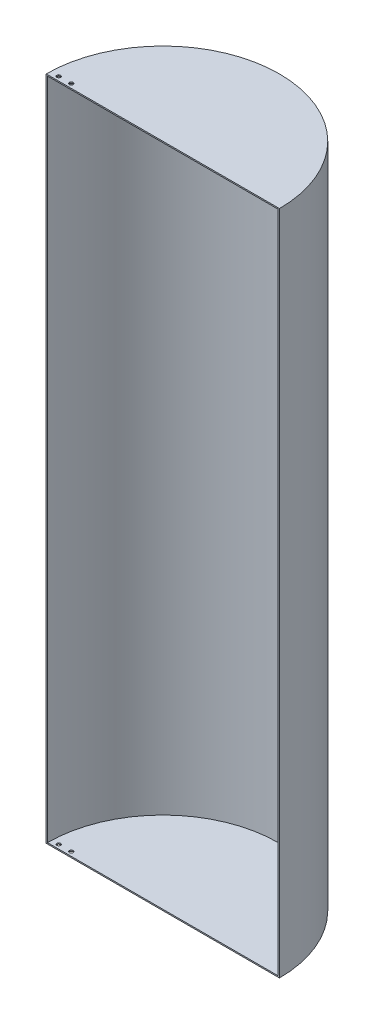
ISO-10303-21;
HEADER;
FILE_DESCRIPTION(('STEP AP214'),'2;1');
FILE_NAME('part.step','',(''),(''),'','','');
FILE_SCHEMA(('AUTOMOTIVE_DESIGN { 1 0 10303 214 1 1 1 1 }'));
ENDSEC;
DATA;
#1=APPLICATION_CONTEXT('core data for automotive mechanical design processes');
#2=APPLICATION_PROTOCOL_DEFINITION('international standard','automotive_design',2000,#1);
#3=PRODUCT_CONTEXT('',#1,'mechanical');
#4=PRODUCT('Part','Part','',(#3));
#5=PRODUCT_RELATED_PRODUCT_CATEGORY('part','',(#4));
#6=PRODUCT_DEFINITION_FORMATION('','',#4);
#7=PRODUCT_DEFINITION_CONTEXT('part definition',#1,'design');
#8=PRODUCT_DEFINITION('design','',#6,#7);
#9=PRODUCT_DEFINITION_SHAPE('','',#8);
#10=(LENGTH_UNIT() NAMED_UNIT(*) SI_UNIT(.MILLI.,.METRE.));
#11=(NAMED_UNIT(*) PLANE_ANGLE_UNIT() SI_UNIT($,.RADIAN.));
#12=(NAMED_UNIT(*) SI_UNIT($,.STERADIAN.) SOLID_ANGLE_UNIT());
#13=UNCERTAINTY_MEASURE_WITH_UNIT(LENGTH_MEASURE(1.E-05),#10,'distance_accuracy_value','');
#14=(GEOMETRIC_REPRESENTATION_CONTEXT(3) GLOBAL_UNCERTAINTY_ASSIGNED_CONTEXT((#13)) GLOBAL_UNIT_ASSIGNED_CONTEXT((#10,
#11,#12)) REPRESENTATION_CONTEXT('',''));
#15=CARTESIAN_POINT('',(0.,0.,0.));
#16=DIRECTION('',(0.,0.,1.));
#17=DIRECTION('',(1.,0.,0.));
#18=AXIS2_PLACEMENT_3D('',#15,#16,#17);
#19=CARTESIAN_POINT('',(-140.,800.,0.));
#20=DIRECTION('',(0.,0.,-1.));
#21=DIRECTION('',(-1.,0.,0.));
#22=AXIS2_PLACEMENT_3D('',#19,#20,#21);
#23=PLANE('',#22);
#24=DIRECTION('',(1.,0.,0.));
#25=VECTOR('',#24,1.);
#26=CARTESIAN_POINT('',(-140.,0.,0.));
#27=LINE('',#26,#25);
#28=CARTESIAN_POINT('',(-140.,0.,0.));
#29=VERTEX_POINT('',#28);
#30=CARTESIAN_POINT('',(140.,0.,0.));
#31=VERTEX_POINT('',#30);
#32=EDGE_CURVE('E79',#29,#31,#27,.T.);
#33=ORIENTED_EDGE('',*,*,#32,.T.);
#34=DIRECTION('',(0.,-1.,0.));
#35=VECTOR('',#34,1.);
#36=CARTESIAN_POINT('',(140.,800.,0.));
#37=LINE('',#36,#35);
#38=CARTESIAN_POINT('',(140.,800.,0.));
#39=VERTEX_POINT('',#38);
#40=EDGE_CURVE('E53',#39,#31,#37,.T.);
#41=ORIENTED_EDGE('',*,*,#40,.F.);
#42=DIRECTION('',(1.,0.,0.));
#43=VECTOR('',#42,1.);
#44=CARTESIAN_POINT('',(-140.,800.,0.));
#45=LINE('',#44,#43);
#46=CARTESIAN_POINT('',(-140.,800.,0.));
#47=VERTEX_POINT('',#46);
#48=EDGE_CURVE('E68',#47,#39,#45,.T.);
#49=ORIENTED_EDGE('',*,*,#48,.F.);
#50=DIRECTION('',(0.,-1.,0.));
#51=VECTOR('',#50,1.);
#52=CARTESIAN_POINT('',(-140.,800.,0.));
#53=LINE('',#52,#51);
#54=EDGE_CURVE('E11',#47,#29,#53,.T.);
#55=ORIENTED_EDGE('',*,*,#54,.T.);
#56=EDGE_LOOP('',(#33,#41,#49,#55));
#57=FACE_BOUND('',#56,.T.);
#58=DIRECTION('',(1.,0.,0.));
#59=VECTOR('',#58,1.);
#60=CARTESIAN_POINT('',(-140.,1.49999999999995,0.));
#61=LINE('',#60,#59);
#62=CARTESIAN_POINT('',(-138.5,1.5,0.));
#63=VERTEX_POINT('',#62);
#64=CARTESIAN_POINT('',(138.5,1.5,0.));
#65=VERTEX_POINT('',#64);
#66=EDGE_CURVE('E113',#63,#65,#61,.T.);
#67=ORIENTED_EDGE('',*,*,#66,.F.);
#68=DIRECTION('',(0.,-1.,0.));
#69=VECTOR('',#68,1.);
#70=CARTESIAN_POINT('',(-138.5,798.5,0.));
#71=LINE('',#70,#69);
#72=CARTESIAN_POINT('',(-138.5,798.5,0.));
#73=VERTEX_POINT('',#72);
#74=EDGE_CURVE('E96',#73,#63,#71,.T.);
#75=ORIENTED_EDGE('',*,*,#74,.F.);
#76=DIRECTION('',(1.,0.,0.));
#77=VECTOR('',#76,1.);
#78=CARTESIAN_POINT('',(-140.,798.5,0.));
#79=LINE('',#78,#77);
#80=CARTESIAN_POINT('',(138.5,798.5,0.));
#81=VERTEX_POINT('',#80);
#82=EDGE_CURVE('E106',#73,#81,#79,.T.);
#83=ORIENTED_EDGE('',*,*,#82,.T.);
#84=DIRECTION('',(0.,-1.,0.));
#85=VECTOR('',#84,1.);
#86=CARTESIAN_POINT('',(138.5,798.5,0.));
#87=LINE('',#86,#85);
#88=EDGE_CURVE('E99',#81,#65,#87,.T.);
#89=ORIENTED_EDGE('',*,*,#88,.T.);
#90=EDGE_LOOP('',(#67,#75,#83,#89));
#91=FACE_BOUND('',#90,.T.);
#92=ADVANCED_FACE('F43',(#57,#91),#23,.F.);
#93=CARTESIAN_POINT('',(0.,800.,0.));
#94=DIRECTION('',(0.,-1.,0.));
#95=DIRECTION('',(0.,0.,-1.));
#96=AXIS2_PLACEMENT_3D('',#93,#94,#95);
#97=CYLINDRICAL_SURFACE('',#96,140.);
#98=CARTESIAN_POINT('',(0.,0.,0.));
#99=DIRECTION('',(0.,1.,0.));
#100=DIRECTION('',(0.,0.,1.));
#101=AXIS2_PLACEMENT_3D('',#98,#99,#100);
#102=CIRCLE('',#101,140.);
#103=EDGE_CURVE('E89',#31,#29,#102,.T.);
#104=ORIENTED_EDGE('',*,*,#103,.T.);
#105=ORIENTED_EDGE('',*,*,#54,.F.);
#106=CARTESIAN_POINT('',(0.,800.,0.));
#107=DIRECTION('',(0.,1.,0.));
#108=DIRECTION('',(0.,0.,1.));
#109=AXIS2_PLACEMENT_3D('',#106,#107,#108);
#110=CIRCLE('',#109,140.);
#111=EDGE_CURVE('E88',#39,#47,#110,.T.);
#112=ORIENTED_EDGE('',*,*,#111,.F.);
#113=ORIENTED_EDGE('',*,*,#40,.T.);
#114=EDGE_LOOP('',(#104,#105,#112,#113));
#115=FACE_BOUND('',#114,.T.);
#116=ADVANCED_FACE('F45',(#115),#97,.T.);
#117=CARTESIAN_POINT('',(0.,800.,0.));
#118=DIRECTION('',(0.,1.,0.));
#119=DIRECTION('',(0.,0.,1.));
#120=AXIS2_PLACEMENT_3D('',#117,#118,#119);
#121=PLANE('',#120);
#122=CARTESIAN_POINT('',(-130.,800.,-5.));
#123=DIRECTION('',(0.,1.,0.));
#124=DIRECTION('',(0.,0.,1.));
#125=AXIS2_PLACEMENT_3D('',#122,#123,#124);
#126=CIRCLE('',#125,2.275);
#127=CARTESIAN_POINT('',(-130.,800.,-2.725));
#128=VERTEX_POINT('',#127);
#129=EDGE_CURVE('E155',#128,#128,#126,.T.);
#130=ORIENTED_EDGE('',*,*,#129,.F.);
#131=EDGE_LOOP('',(#130));
#132=FACE_BOUND('',#131,.T.);
#133=CARTESIAN_POINT('',(-115.,800.,-5.));
#134=DIRECTION('',(0.,1.,0.));
#135=DIRECTION('',(0.,0.,1.));
#136=AXIS2_PLACEMENT_3D('',#133,#134,#135);
#137=CIRCLE('',#136,2.275);
#138=CARTESIAN_POINT('',(-115.,800.,-2.725));
#139=VERTEX_POINT('',#138);
#140=EDGE_CURVE('E135',#139,#139,#137,.T.);
#141=ORIENTED_EDGE('',*,*,#140,.F.);
#142=EDGE_LOOP('',(#141));
#143=FACE_BOUND('',#142,.T.);
#144=ORIENTED_EDGE('',*,*,#111,.T.);
#145=ORIENTED_EDGE('',*,*,#48,.T.);
#146=EDGE_LOOP('',(#144,#145));
#147=FACE_BOUND('',#146,.T.);
#148=ADVANCED_FACE('F162',(#132,#143,#147),#121,.T.);
#149=CARTESIAN_POINT('',(0.,0.,0.));
#150=DIRECTION('',(0.,1.,0.));
#151=DIRECTION('',(0.,0.,1.));
#152=AXIS2_PLACEMENT_3D('',#149,#150,#151);
#153=PLANE('',#152);
#154=CARTESIAN_POINT('',(-130.,0.,-5.));
#155=DIRECTION('',(0.,1.,0.));
#156=DIRECTION('',(0.,0.,1.));
#157=AXIS2_PLACEMENT_3D('',#154,#155,#156);
#158=CIRCLE('',#157,2.24999999999981);
#159=CARTESIAN_POINT('',(-130.,0.,-2.75000000000019));
#160=VERTEX_POINT('',#159);
#161=EDGE_CURVE('E147',#160,#160,#158,.T.);
#162=ORIENTED_EDGE('',*,*,#161,.T.);
#163=EDGE_LOOP('',(#162));
#164=FACE_BOUND('',#163,.T.);
#165=CARTESIAN_POINT('',(-115.,0.,-5.));
#166=DIRECTION('',(0.,1.,0.));
#167=DIRECTION('',(0.,0.,1.));
#168=AXIS2_PLACEMENT_3D('',#165,#166,#167);
#169=CIRCLE('',#168,2.24999999999981);
#170=CARTESIAN_POINT('',(-115.,0.,-2.75000000000019));
#171=VERTEX_POINT('',#170);
#172=EDGE_CURVE('E127',#171,#171,#169,.T.);
#173=ORIENTED_EDGE('',*,*,#172,.T.);
#174=EDGE_LOOP('',(#173));
#175=FACE_BOUND('',#174,.T.);
#176=ORIENTED_EDGE('',*,*,#103,.F.);
#177=ORIENTED_EDGE('',*,*,#32,.F.);
#178=EDGE_LOOP('',(#176,#177));
#179=FACE_BOUND('',#178,.T.);
#180=ADVANCED_FACE('F94',(#164,#175,#179),#153,.F.);
#181=CARTESIAN_POINT('',(0.,800.,0.));
#182=DIRECTION('',(0.,-1.,0.));
#183=DIRECTION('',(0.,0.,-1.));
#184=AXIS2_PLACEMENT_3D('',#181,#182,#183);
#185=CYLINDRICAL_SURFACE('',#184,138.5);
#186=CARTESIAN_POINT('',(0.,1.49999999999995,0.));
#187=DIRECTION('',(0.,1.,0.));
#188=DIRECTION('',(0.,0.,1.));
#189=AXIS2_PLACEMENT_3D('',#186,#187,#188);
#190=CIRCLE('',#189,138.5);
#191=EDGE_CURVE('E116',#65,#63,#190,.T.);
#192=ORIENTED_EDGE('',*,*,#191,.F.);
#193=ORIENTED_EDGE('',*,*,#88,.F.);
#194=CARTESIAN_POINT('',(0.,798.5,0.));
#195=DIRECTION('',(0.,1.,0.));
#196=DIRECTION('',(0.,0.,1.));
#197=AXIS2_PLACEMENT_3D('',#194,#195,#196);
#198=CIRCLE('',#197,138.5);
#199=EDGE_CURVE('E60',#81,#73,#198,.T.);
#200=ORIENTED_EDGE('',*,*,#199,.T.);
#201=ORIENTED_EDGE('',*,*,#74,.T.);
#202=EDGE_LOOP('',(#192,#193,#200,#201));
#203=FACE_BOUND('',#202,.T.);
#204=ADVANCED_FACE('F191',(#203),#185,.F.);
#205=CARTESIAN_POINT('',(0.,798.5,0.));
#206=DIRECTION('',(0.,1.,0.));
#207=DIRECTION('',(0.,0.,1.));
#208=AXIS2_PLACEMENT_3D('',#205,#206,#207);
#209=PLANE('',#208);
#210=CARTESIAN_POINT('',(-130.,798.5,-5.));
#211=DIRECTION('',(0.,1.,0.));
#212=DIRECTION('',(0.,0.,1.));
#213=AXIS2_PLACEMENT_3D('',#210,#211,#212);
#214=CIRCLE('',#213,2.24999999999985);
#215=CARTESIAN_POINT('',(-130.,798.5,-2.75000000000015));
#216=VERTEX_POINT('',#215);
#217=EDGE_CURVE('E139',#216,#216,#214,.T.);
#218=ORIENTED_EDGE('',*,*,#217,.T.);
#219=EDGE_LOOP('',(#218));
#220=FACE_BOUND('',#219,.T.);
#221=CARTESIAN_POINT('',(-115.,798.5,-5.));
#222=DIRECTION('',(0.,1.,0.));
#223=DIRECTION('',(0.,0.,1.));
#224=AXIS2_PLACEMENT_3D('',#221,#222,#223);
#225=CIRCLE('',#224,2.24999999999986);
#226=CARTESIAN_POINT('',(-115.,798.5,-2.75000000000014));
#227=VERTEX_POINT('',#226);
#228=EDGE_CURVE('E47',#227,#227,#225,.T.);
#229=ORIENTED_EDGE('',*,*,#228,.T.);
#230=EDGE_LOOP('',(#229));
#231=FACE_BOUND('',#230,.T.);
#232=ORIENTED_EDGE('',*,*,#199,.F.);
#233=ORIENTED_EDGE('',*,*,#82,.F.);
#234=EDGE_LOOP('',(#232,#233));
#235=FACE_BOUND('',#234,.T.);
#236=ADVANCED_FACE('F196',(#220,#231,#235),#209,.F.);
#237=CARTESIAN_POINT('',(0.,1.5,0.));
#238=DIRECTION('',(0.,1.,0.));
#239=DIRECTION('',(0.,0.,1.));
#240=AXIS2_PLACEMENT_3D('',#237,#238,#239);
#241=PLANE('',#240);
#242=CARTESIAN_POINT('',(-130.,1.49999999999995,-5.));
#243=DIRECTION('',(0.,1.,0.));
#244=DIRECTION('',(0.,0.,1.));
#245=AXIS2_PLACEMENT_3D('',#242,#243,#244);
#246=CIRCLE('',#245,2.24999999999985);
#247=CARTESIAN_POINT('',(-130.,1.49999999999995,-2.75000000000015));
#248=VERTEX_POINT('',#247);
#249=EDGE_CURVE('E143',#248,#248,#246,.T.);
#250=ORIENTED_EDGE('',*,*,#249,.F.);
#251=EDGE_LOOP('',(#250));
#252=FACE_BOUND('',#251,.T.);
#253=CARTESIAN_POINT('',(-115.,1.49999999999995,-5.));
#254=DIRECTION('',(0.,1.,0.));
#255=DIRECTION('',(0.,0.,1.));
#256=AXIS2_PLACEMENT_3D('',#253,#254,#255);
#257=CIRCLE('',#256,2.24999999999986);
#258=CARTESIAN_POINT('',(-115.,1.49999999999995,-2.75000000000014));
#259=VERTEX_POINT('',#258);
#260=EDGE_CURVE('E123',#259,#259,#257,.T.);
#261=ORIENTED_EDGE('',*,*,#260,.F.);
#262=EDGE_LOOP('',(#261));
#263=FACE_BOUND('',#262,.T.);
#264=ORIENTED_EDGE('',*,*,#191,.T.);
#265=ORIENTED_EDGE('',*,*,#66,.T.);
#266=EDGE_LOOP('',(#264,#265));
#267=FACE_BOUND('',#266,.T.);
#268=ADVANCED_FACE('F181',(#252,#263,#267),#241,.T.);
#269=CARTESIAN_POINT('',(-115.,800.,-5.));
#270=DIRECTION('',(0.,1.,0.));
#271=DIRECTION('',(0.,0.,1.));
#272=AXIS2_PLACEMENT_3D('',#269,#270,#271);
#273=CYLINDRICAL_SURFACE('',#272,2.24999999999986);
#274=CARTESIAN_POINT('',(-115.,799.97902250922,-5.));
#275=DIRECTION('',(0.,1.,0.));
#276=DIRECTION('',(0.,0.,1.));
#277=AXIS2_PLACEMENT_3D('',#274,#275,#276);
#278=CIRCLE('',#277,2.2499999999999);
#279=CARTESIAN_POINT('',(-115.,799.97902250922,-2.7500000000001));
#280=VERTEX_POINT('',#279);
#281=EDGE_CURVE('E131',#280,#280,#278,.T.);
#282=ORIENTED_EDGE('',*,*,#281,.T.);
#283=EDGE_LOOP('',(#282));
#284=FACE_BOUND('',#283,.T.);
#285=ORIENTED_EDGE('',*,*,#228,.F.);
#286=EDGE_LOOP('',(#285));
#287=FACE_BOUND('',#286,.T.);
#288=ADVANCED_FACE('F171',(#284,#287),#273,.F.);
#289=CARTESIAN_POINT('',(-115.,800.,-5.));
#290=DIRECTION('',(0.,1.,0.));
#291=DIRECTION('',(0.,0.,1.));
#292=AXIS2_PLACEMENT_3D('',#289,#290,#291);
#293=CONICAL_SURFACE('',#292,2.275,0.87266462599599);
#294=ORIENTED_EDGE('',*,*,#281,.F.);
#295=EDGE_LOOP('',(#294));
#296=FACE_BOUND('',#295,.T.);
#297=ORIENTED_EDGE('',*,*,#140,.T.);
#298=EDGE_LOOP('',(#297));
#299=FACE_BOUND('',#298,.T.);
#300=ADVANCED_FACE('F168',(#296,#299),#293,.F.);
#301=ORIENTED_EDGE('',*,*,#260,.T.);
#302=EDGE_LOOP('',(#301));
#303=FACE_BOUND('',#302,.T.);
#304=ORIENTED_EDGE('',*,*,#172,.F.);
#305=EDGE_LOOP('',(#304));
#306=FACE_BOUND('',#305,.T.);
#307=ADVANCED_FACE('F170',(#303,#306),#273,.F.);
#308=CARTESIAN_POINT('',(-130.,800.,-5.));
#309=DIRECTION('',(0.,1.,0.));
#310=DIRECTION('',(0.,0.,1.));
#311=AXIS2_PLACEMENT_3D('',#308,#309,#310);
#312=CYLINDRICAL_SURFACE('',#311,2.24999999999985);
#313=ORIENTED_EDGE('',*,*,#249,.T.);
#314=EDGE_LOOP('',(#313));
#315=FACE_BOUND('',#314,.T.);
#316=ORIENTED_EDGE('',*,*,#161,.F.);
#317=EDGE_LOOP('',(#316));
#318=FACE_BOUND('',#317,.T.);
#319=ADVANCED_FACE('F178',(#315,#318),#312,.F.);
#320=CARTESIAN_POINT('',(-130.,799.97902250922,-5.));
#321=DIRECTION('',(0.,1.,0.));
#322=DIRECTION('',(0.,0.,1.));
#323=AXIS2_PLACEMENT_3D('',#320,#321,#322);
#324=CIRCLE('',#323,2.24999999999989);
#325=CARTESIAN_POINT('',(-130.,799.97902250922,-2.75000000000011));
#326=VERTEX_POINT('',#325);
#327=EDGE_CURVE('E151',#326,#326,#324,.T.);
#328=ORIENTED_EDGE('',*,*,#327,.T.);
#329=EDGE_LOOP('',(#328));
#330=FACE_BOUND('',#329,.T.);
#331=ORIENTED_EDGE('',*,*,#217,.F.);
#332=EDGE_LOOP('',(#331));
#333=FACE_BOUND('',#332,.T.);
#334=ADVANCED_FACE('F250',(#330,#333),#312,.F.);
#335=CARTESIAN_POINT('',(-130.,800.,-5.));
#336=DIRECTION('',(0.,1.,0.));
#337=DIRECTION('',(0.,0.,1.));
#338=AXIS2_PLACEMENT_3D('',#335,#336,#337);
#339=CONICAL_SURFACE('',#338,2.275,0.872664625996264);
#340=ORIENTED_EDGE('',*,*,#327,.F.);
#341=EDGE_LOOP('',(#340));
#342=FACE_BOUND('',#341,.T.);
#343=ORIENTED_EDGE('',*,*,#129,.T.);
#344=EDGE_LOOP('',(#343));
#345=FACE_BOUND('',#344,.T.);
#346=ADVANCED_FACE('F160',(#342,#345),#339,.F.);
#347=CLOSED_SHELL('',(#92,#116,#148,#180,#204,#236,#268,#288,#300,#307,#319,#334,#346));
#348=MANIFOLD_SOLID_BREP('B2',#347);
#349=ADVANCED_BREP_SHAPE_REPRESENTATION('',(#18,#348),#14);
#350=SHAPE_DEFINITION_REPRESENTATION(#9,#349);
ENDSEC;
END-ISO-10303-21;
